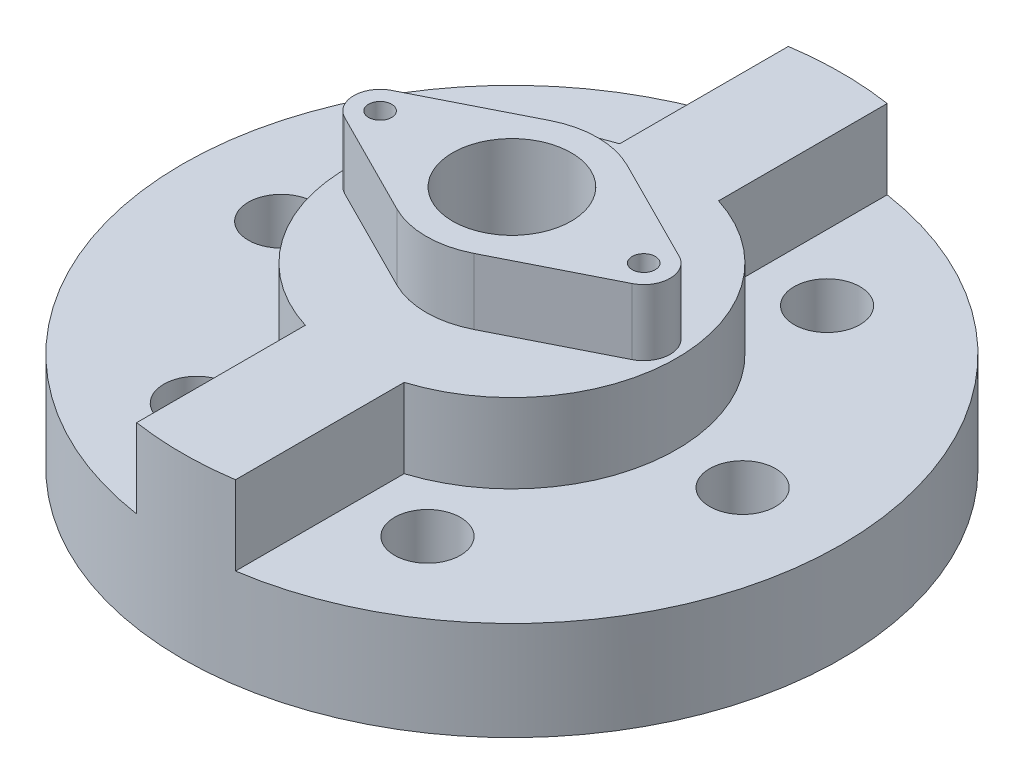
ISO-10303-21;
HEADER;
FILE_DESCRIPTION(('STEP AP214'),'2;1');
FILE_NAME('part.step','',(''),(''),'','','');
FILE_SCHEMA(('AUTOMOTIVE_DESIGN { 1 0 10303 214 1 1 1 1 }'));
ENDSEC;
DATA;
#1=APPLICATION_CONTEXT('core data for automotive mechanical design processes');
#2=APPLICATION_PROTOCOL_DEFINITION('international standard','automotive_design',2000,#1);
#3=PRODUCT_CONTEXT('',#1,'mechanical');
#4=PRODUCT('Part','Part','',(#3));
#5=PRODUCT_RELATED_PRODUCT_CATEGORY('part','',(#4));
#6=PRODUCT_DEFINITION_FORMATION('','',#4);
#7=PRODUCT_DEFINITION_CONTEXT('part definition',#1,'design');
#8=PRODUCT_DEFINITION('design','',#6,#7);
#9=PRODUCT_DEFINITION_SHAPE('','',#8);
#10=(LENGTH_UNIT() NAMED_UNIT(*) SI_UNIT(.MILLI.,.METRE.));
#11=(NAMED_UNIT(*) PLANE_ANGLE_UNIT() SI_UNIT($,.RADIAN.));
#12=(NAMED_UNIT(*) SI_UNIT($,.STERADIAN.) SOLID_ANGLE_UNIT());
#13=UNCERTAINTY_MEASURE_WITH_UNIT(LENGTH_MEASURE(1.E-05),#10,'distance_accuracy_value','');
#14=(GEOMETRIC_REPRESENTATION_CONTEXT(3) GLOBAL_UNCERTAINTY_ASSIGNED_CONTEXT((#13)) GLOBAL_UNIT_ASSIGNED_CONTEXT((#10,
#11,#12)) REPRESENTATION_CONTEXT('',''));
#15=CARTESIAN_POINT('',(0.,0.,0.));
#16=DIRECTION('',(0.,0.,1.));
#17=DIRECTION('',(1.,0.,0.));
#18=AXIS2_PLACEMENT_3D('',#15,#16,#17);
#19=CARTESIAN_POINT('',(0.,15.,0.));
#20=DIRECTION('',(0.,1.,0.));
#21=DIRECTION('',(0.,0.,1.));
#22=AXIS2_PLACEMENT_3D('',#19,#20,#21);
#23=PLANE('',#22);
#24=CARTESIAN_POINT('',(-17.4999999999997,15.,30.3108891324555));
#25=DIRECTION('',(0.,1.,0.));
#26=DIRECTION('',(0.,0.,1.));
#27=AXIS2_PLACEMENT_3D('',#24,#25,#26);
#28=CIRCLE('',#27,5.00000000000001);
#29=CARTESIAN_POINT('',(-17.4999999999997,15.,35.3108891324555));
#30=VERTEX_POINT('',#29);
#31=EDGE_CURVE('E660',#30,#30,#28,.T.);
#32=ORIENTED_EDGE('',*,*,#31,.F.);
#33=EDGE_LOOP('',(#32));
#34=FACE_BOUND('',#33,.T.);
#35=CARTESIAN_POINT('',(-35.,15.,0.));
#36=DIRECTION('',(0.,1.,0.));
#37=DIRECTION('',(0.,0.,1.));
#38=AXIS2_PLACEMENT_3D('',#35,#36,#37);
#39=CIRCLE('',#38,5.00000000000001);
#40=CARTESIAN_POINT('',(-35.,15.,5.00000000000001));
#41=VERTEX_POINT('',#40);
#42=EDGE_CURVE('E670',#41,#41,#39,.T.);
#43=ORIENTED_EDGE('',*,*,#42,.F.);
#44=EDGE_LOOP('',(#43));
#45=FACE_BOUND('',#44,.T.);
#46=CARTESIAN_POINT('',(-17.5000000000001,15.,-30.3108891324553));
#47=DIRECTION('',(0.,1.,0.));
#48=DIRECTION('',(0.,0.,1.));
#49=AXIS2_PLACEMENT_3D('',#46,#47,#48);
#50=CIRCLE('',#49,5.00000000000001);
#51=CARTESIAN_POINT('',(-17.5000000000001,15.,-25.3108891324553));
#52=VERTEX_POINT('',#51);
#53=EDGE_CURVE('E678',#52,#52,#50,.T.);
#54=ORIENTED_EDGE('',*,*,#53,.F.);
#55=EDGE_LOOP('',(#54));
#56=FACE_BOUND('',#55,.T.);
#57=DIRECTION('',(0.,0.,1.));
#58=VECTOR('',#57,1.);
#59=CARTESIAN_POINT('',(-7.50000000000001,15.,23.8484800354236));
#60=LINE('',#59,#58);
#61=CARTESIAN_POINT('',(-7.50000000000001,15.,23.8484800354236));
#62=VERTEX_POINT('',#61);
#63=CARTESIAN_POINT('',(-7.50000000000001,15.,49.434299833213));
#64=VERTEX_POINT('',#63);
#65=EDGE_CURVE('E199',#62,#64,#60,.T.);
#66=ORIENTED_EDGE('',*,*,#65,.F.);
#67=CARTESIAN_POINT('',(0.,15.,0.));
#68=DIRECTION('',(0.,1.,0.));
#69=DIRECTION('',(0.,0.,1.));
#70=AXIS2_PLACEMENT_3D('',#67,#68,#69);
#71=CIRCLE('',#70,25.);
#72=CARTESIAN_POINT('',(-7.5,15.,-23.8484800354236));
#73=VERTEX_POINT('',#72);
#74=EDGE_CURVE('E232',#73,#62,#71,.T.);
#75=ORIENTED_EDGE('',*,*,#74,.F.);
#76=DIRECTION('',(0.,0.,1.));
#77=VECTOR('',#76,1.);
#78=CARTESIAN_POINT('',(-7.5,15.,-49.434299833213));
#79=LINE('',#78,#77);
#80=CARTESIAN_POINT('',(-7.5,15.,-49.434299833213));
#81=VERTEX_POINT('',#80);
#82=EDGE_CURVE('E228',#81,#73,#79,.T.);
#83=ORIENTED_EDGE('',*,*,#82,.F.);
#84=CARTESIAN_POINT('',(0.,15.,0.));
#85=DIRECTION('',(0.,1.,0.));
#86=DIRECTION('',(0.,0.,1.));
#87=AXIS2_PLACEMENT_3D('',#84,#85,#86);
#88=CIRCLE('',#87,50.);
#89=EDGE_CURVE('E55',#81,#64,#88,.T.);
#90=ORIENTED_EDGE('',*,*,#89,.T.);
#91=EDGE_LOOP('',(#66,#75,#83,#90));
#92=FACE_BOUND('',#91,.T.);
#93=ADVANCED_FACE('F45',(#34,#45,#56,#92),#23,.T.);
#94=CARTESIAN_POINT('',(0.,15.,0.));
#95=DIRECTION('',(0.,-1.,0.));
#96=DIRECTION('',(0.,0.,-1.));
#97=AXIS2_PLACEMENT_3D('',#94,#95,#96);
#98=CYLINDRICAL_SURFACE('',#97,50.);
#99=CARTESIAN_POINT('',(7.50000000000001,15.,49.434299833213));
#100=VERTEX_POINT('',#99);
#101=CARTESIAN_POINT('',(7.5,15.,-49.434299833213));
#102=VERTEX_POINT('',#101);
#103=EDGE_CURVE('E11',#100,#102,#88,.T.);
#104=ORIENTED_EDGE('',*,*,#103,.F.);
#105=DIRECTION('',(0.,-1.,0.));
#106=VECTOR('',#105,1.);
#107=CARTESIAN_POINT('',(7.50000000000001,27.,49.434299833213));
#108=LINE('',#107,#106);
#109=CARTESIAN_POINT('',(7.50000000000001,27.,49.434299833213));
#110=VERTEX_POINT('',#109);
#111=EDGE_CURVE('E266',#110,#100,#108,.T.);
#112=ORIENTED_EDGE('',*,*,#111,.F.);
#113=CARTESIAN_POINT('',(0.,27.,0.));
#114=DIRECTION('',(0.,1.,0.));
#115=DIRECTION('',(0.,0.,1.));
#116=AXIS2_PLACEMENT_3D('',#113,#114,#115);
#117=CIRCLE('',#116,50.);
#118=CARTESIAN_POINT('',(-7.50000000000001,27.,49.434299833213));
#119=VERTEX_POINT('',#118);
#120=EDGE_CURVE('E194',#119,#110,#117,.T.);
#121=ORIENTED_EDGE('',*,*,#120,.F.);
#122=DIRECTION('',(0.,-1.,0.));
#123=VECTOR('',#122,1.);
#124=CARTESIAN_POINT('',(-7.50000000000001,27.,49.434299833213));
#125=LINE('',#124,#123);
#126=EDGE_CURVE('E219',#119,#64,#125,.T.);
#127=ORIENTED_EDGE('',*,*,#126,.T.);
#128=ORIENTED_EDGE('',*,*,#89,.F.);
#129=DIRECTION('',(0.,-1.,0.));
#130=VECTOR('',#129,1.);
#131=CARTESIAN_POINT('',(-7.5,27.,-49.434299833213));
#132=LINE('',#131,#130);
#133=CARTESIAN_POINT('',(-7.5,27.,-49.434299833213));
#134=VERTEX_POINT('',#133);
#135=EDGE_CURVE('E250',#134,#81,#132,.T.);
#136=ORIENTED_EDGE('',*,*,#135,.F.);
#137=CARTESIAN_POINT('',(0.,27.,0.));
#138=DIRECTION('',(0.,1.,0.));
#139=DIRECTION('',(0.,0.,1.));
#140=AXIS2_PLACEMENT_3D('',#137,#138,#139);
#141=CIRCLE('',#140,50.);
#142=CARTESIAN_POINT('',(7.5,27.,-49.434299833213));
#143=VERTEX_POINT('',#142);
#144=EDGE_CURVE('E208',#143,#134,#141,.T.);
#145=ORIENTED_EDGE('',*,*,#144,.F.);
#146=DIRECTION('',(0.,-1.,0.));
#147=VECTOR('',#146,1.);
#148=CARTESIAN_POINT('',(7.5,27.,-49.434299833213));
#149=LINE('',#148,#147);
#150=EDGE_CURVE('E254',#143,#102,#149,.T.);
#151=ORIENTED_EDGE('',*,*,#150,.T.);
#152=EDGE_LOOP('',(#104,#112,#121,#127,#128,#136,#145,#151));
#153=FACE_BOUND('',#152,.T.);
#154=CARTESIAN_POINT('',(0.,0.,0.));
#155=DIRECTION('',(0.,1.,0.));
#156=DIRECTION('',(0.,0.,1.));
#157=AXIS2_PLACEMENT_3D('',#154,#155,#156);
#158=CIRCLE('',#157,50.);
#159=CARTESIAN_POINT('',(0.,0.,50.));
#160=VERTEX_POINT('',#159);
#161=EDGE_CURVE('E49',#160,#160,#158,.T.);
#162=ORIENTED_EDGE('',*,*,#161,.T.);
#163=EDGE_LOOP('',(#162));
#164=FACE_BOUND('',#163,.T.);
#165=ADVANCED_FACE('F47',(#153,#164),#98,.T.);
#166=CARTESIAN_POINT('',(17.5000000000004,15.,30.3108891324552));
#167=DIRECTION('',(0.,1.,0.));
#168=DIRECTION('',(0.,0.,1.));
#169=AXIS2_PLACEMENT_3D('',#166,#167,#168);
#170=CIRCLE('',#169,5.00000000000001);
#171=CARTESIAN_POINT('',(17.5000000000004,15.,35.3108891324552));
#172=VERTEX_POINT('',#171);
#173=EDGE_CURVE('E334',#172,#172,#170,.T.);
#174=ORIENTED_EDGE('',*,*,#173,.F.);
#175=EDGE_LOOP('',(#174));
#176=FACE_BOUND('',#175,.T.);
#177=CARTESIAN_POINT('',(17.4999999999999,15.,-30.3108891324554));
#178=DIRECTION('',(0.,1.,0.));
#179=DIRECTION('',(0.,0.,1.));
#180=AXIS2_PLACEMENT_3D('',#177,#178,#179);
#181=CIRCLE('',#180,5.00000000000001);
#182=CARTESIAN_POINT('',(17.4999999999999,15.,-25.3108891324554));
#183=VERTEX_POINT('',#182);
#184=EDGE_CURVE('E338',#183,#183,#181,.T.);
#185=ORIENTED_EDGE('',*,*,#184,.F.);
#186=EDGE_LOOP('',(#185));
#187=FACE_BOUND('',#186,.T.);
#188=CARTESIAN_POINT('',(35.,15.,0.));
#189=DIRECTION('',(0.,1.,0.));
#190=DIRECTION('',(0.,0.,1.));
#191=AXIS2_PLACEMENT_3D('',#188,#189,#190);
#192=CIRCLE('',#191,5.00000000000001);
#193=CARTESIAN_POINT('',(35.,15.,5.00000000000001));
#194=VERTEX_POINT('',#193);
#195=EDGE_CURVE('E341',#194,#194,#192,.T.);
#196=ORIENTED_EDGE('',*,*,#195,.F.);
#197=EDGE_LOOP('',(#196));
#198=FACE_BOUND('',#197,.T.);
#199=DIRECTION('',(0.,0.,-1.));
#200=VECTOR('',#199,1.);
#201=CARTESIAN_POINT('',(7.5,15.,-49.434299833213));
#202=LINE('',#201,#200);
#203=CARTESIAN_POINT('',(7.5,15.,-23.8484800354236));
#204=VERTEX_POINT('',#203);
#205=EDGE_CURVE('E224',#204,#102,#202,.T.);
#206=ORIENTED_EDGE('',*,*,#205,.F.);
#207=CARTESIAN_POINT('',(0.,15.,0.));
#208=DIRECTION('',(0.,1.,0.));
#209=DIRECTION('',(0.,0.,1.));
#210=AXIS2_PLACEMENT_3D('',#207,#208,#209);
#211=CIRCLE('',#210,25.);
#212=CARTESIAN_POINT('',(7.50000000000001,15.,23.8484800354236));
#213=VERTEX_POINT('',#212);
#214=EDGE_CURVE('E188',#213,#204,#211,.T.);
#215=ORIENTED_EDGE('',*,*,#214,.F.);
#216=DIRECTION('',(0.,0.,-1.));
#217=VECTOR('',#216,1.);
#218=CARTESIAN_POINT('',(7.50000000000001,15.,23.8484800354236));
#219=LINE('',#218,#217);
#220=EDGE_CURVE('E183',#100,#213,#219,.T.);
#221=ORIENTED_EDGE('',*,*,#220,.F.);
#222=ORIENTED_EDGE('',*,*,#103,.T.);
#223=EDGE_LOOP('',(#206,#215,#221,#222));
#224=FACE_BOUND('',#223,.T.);
#225=ADVANCED_FACE('F305',(#176,#187,#198,#224),#23,.T.);
#226=CARTESIAN_POINT('',(0.,0.,0.));
#227=DIRECTION('',(0.,1.,0.));
#228=DIRECTION('',(0.,0.,1.));
#229=AXIS2_PLACEMENT_3D('',#226,#227,#228);
#230=PLANE('',#229);
#231=CARTESIAN_POINT('',(17.5000000000004,0.,30.3108891324552));
#232=DIRECTION('',(0.,1.,0.));
#233=DIRECTION('',(0.,0.,1.));
#234=AXIS2_PLACEMENT_3D('',#231,#232,#233);
#235=CIRCLE('',#234,5.00000000000001);
#236=CARTESIAN_POINT('',(17.5000000000004,0.,35.3108891324552));
#237=VERTEX_POINT('',#236);
#238=EDGE_CURVE('E656',#237,#237,#235,.T.);
#239=ORIENTED_EDGE('',*,*,#238,.T.);
#240=EDGE_LOOP('',(#239));
#241=FACE_BOUND('',#240,.T.);
#242=CARTESIAN_POINT('',(-17.4999999999997,0.,30.3108891324555));
#243=DIRECTION('',(0.,1.,0.));
#244=DIRECTION('',(0.,0.,1.));
#245=AXIS2_PLACEMENT_3D('',#242,#243,#244);
#246=CIRCLE('',#245,5.00000000000001);
#247=CARTESIAN_POINT('',(-17.4999999999997,0.,35.3108891324555));
#248=VERTEX_POINT('',#247);
#249=EDGE_CURVE('E666',#248,#248,#246,.T.);
#250=ORIENTED_EDGE('',*,*,#249,.T.);
#251=EDGE_LOOP('',(#250));
#252=FACE_BOUND('',#251,.T.);
#253=CARTESIAN_POINT('',(-35.,0.,0.));
#254=DIRECTION('',(0.,1.,0.));
#255=DIRECTION('',(0.,0.,1.));
#256=AXIS2_PLACEMENT_3D('',#253,#254,#255);
#257=CIRCLE('',#256,5.00000000000001);
#258=CARTESIAN_POINT('',(-35.,0.,5.00000000000001));
#259=VERTEX_POINT('',#258);
#260=EDGE_CURVE('E674',#259,#259,#257,.T.);
#261=ORIENTED_EDGE('',*,*,#260,.T.);
#262=EDGE_LOOP('',(#261));
#263=FACE_BOUND('',#262,.T.);
#264=CARTESIAN_POINT('',(-17.5000000000001,0.,-30.3108891324553));
#265=DIRECTION('',(0.,1.,0.));
#266=DIRECTION('',(0.,0.,1.));
#267=AXIS2_PLACEMENT_3D('',#264,#265,#266);
#268=CIRCLE('',#267,5.00000000000001);
#269=CARTESIAN_POINT('',(-17.5000000000001,0.,-25.3108891324553));
#270=VERTEX_POINT('',#269);
#271=EDGE_CURVE('E682',#270,#270,#268,.T.);
#272=ORIENTED_EDGE('',*,*,#271,.T.);
#273=EDGE_LOOP('',(#272));
#274=FACE_BOUND('',#273,.T.);
#275=CARTESIAN_POINT('',(17.4999999999999,0.,-30.3108891324554));
#276=DIRECTION('',(0.,1.,0.));
#277=DIRECTION('',(0.,0.,1.));
#278=AXIS2_PLACEMENT_3D('',#275,#276,#277);
#279=CIRCLE('',#278,5.00000000000001);
#280=CARTESIAN_POINT('',(17.4999999999999,0.,-25.3108891324554));
#281=VERTEX_POINT('',#280);
#282=EDGE_CURVE('E345',#281,#281,#279,.T.);
#283=ORIENTED_EDGE('',*,*,#282,.T.);
#284=EDGE_LOOP('',(#283));
#285=FACE_BOUND('',#284,.T.);
#286=CARTESIAN_POINT('',(35.,0.,0.));
#287=DIRECTION('',(0.,1.,0.));
#288=DIRECTION('',(0.,0.,1.));
#289=AXIS2_PLACEMENT_3D('',#286,#287,#288);
#290=CIRCLE('',#289,5.00000000000001);
#291=CARTESIAN_POINT('',(35.,0.,5.00000000000001));
#292=VERTEX_POINT('',#291);
#293=EDGE_CURVE('E344',#292,#292,#290,.T.);
#294=ORIENTED_EDGE('',*,*,#293,.T.);
#295=EDGE_LOOP('',(#294));
#296=FACE_BOUND('',#295,.T.);
#297=CARTESIAN_POINT('',(0.,0.,0.));
#298=DIRECTION('',(0.,1.,0.));
#299=DIRECTION('',(0.,0.,1.));
#300=AXIS2_PLACEMENT_3D('',#297,#298,#299);
#301=CIRCLE('',#300,9.00000000000001);
#302=CARTESIAN_POINT('',(0.,0.,9.00000000000001));
#303=VERTEX_POINT('',#302);
#304=EDGE_CURVE('E359',#303,#303,#301,.T.);
#305=ORIENTED_EDGE('',*,*,#304,.T.);
#306=EDGE_LOOP('',(#305));
#307=FACE_BOUND('',#306,.T.);
#308=ORIENTED_EDGE('',*,*,#161,.F.);
#309=EDGE_LOOP('',(#308));
#310=FACE_BOUND('',#309,.T.);
#311=ADVANCED_FACE('F310',(#241,#252,#263,#274,#285,#296,#307,#310),#230,.F.);
#312=CARTESIAN_POINT('',(7.50000000000001,27.,23.8484800354236));
#313=DIRECTION('',(-1.,0.,0.));
#314=DIRECTION('',(0.,0.,1.));
#315=AXIS2_PLACEMENT_3D('',#312,#313,#314);
#316=PLANE('',#315);
#317=ORIENTED_EDGE('',*,*,#220,.T.);
#318=DIRECTION('',(0.,-1.,0.));
#319=VECTOR('',#318,1.);
#320=CARTESIAN_POINT('',(7.50000000000001,27.,23.8484800354236));
#321=LINE('',#320,#319);
#322=CARTESIAN_POINT('',(7.50000000000001,27.,23.8484800354236));
#323=VERTEX_POINT('',#322);
#324=EDGE_CURVE('E262',#323,#213,#321,.T.);
#325=ORIENTED_EDGE('',*,*,#324,.F.);
#326=DIRECTION('',(0.,0.,-1.));
#327=VECTOR('',#326,1.);
#328=CARTESIAN_POINT('',(7.50000000000001,27.,23.8484800354236));
#329=LINE('',#328,#327);
#330=EDGE_CURVE('E198',#110,#323,#329,.T.);
#331=ORIENTED_EDGE('',*,*,#330,.F.);
#332=ORIENTED_EDGE('',*,*,#111,.T.);
#333=EDGE_LOOP('',(#317,#325,#331,#332));
#334=FACE_BOUND('',#333,.T.);
#335=ADVANCED_FACE('F308',(#334),#316,.F.);
#336=CARTESIAN_POINT('',(0.,27.,0.));
#337=DIRECTION('',(0.,-1.,0.));
#338=DIRECTION('',(0.,0.,-1.));
#339=AXIS2_PLACEMENT_3D('',#336,#337,#338);
#340=CYLINDRICAL_SURFACE('',#339,25.);
#341=ORIENTED_EDGE('',*,*,#214,.T.);
#342=DIRECTION('',(0.,-1.,0.));
#343=VECTOR('',#342,1.);
#344=CARTESIAN_POINT('',(7.5,27.,-23.8484800354236));
#345=LINE('',#344,#343);
#346=CARTESIAN_POINT('',(7.5,27.,-23.8484800354236));
#347=VERTEX_POINT('',#346);
#348=EDGE_CURVE('E258',#347,#204,#345,.T.);
#349=ORIENTED_EDGE('',*,*,#348,.F.);
#350=CARTESIAN_POINT('',(0.,27.,0.));
#351=DIRECTION('',(0.,1.,0.));
#352=DIRECTION('',(0.,0.,1.));
#353=AXIS2_PLACEMENT_3D('',#350,#351,#352);
#354=CIRCLE('',#353,25.);
#355=EDGE_CURVE('E202',#323,#347,#354,.T.);
#356=ORIENTED_EDGE('',*,*,#355,.F.);
#357=ORIENTED_EDGE('',*,*,#324,.T.);
#358=EDGE_LOOP('',(#341,#349,#356,#357));
#359=FACE_BOUND('',#358,.T.);
#360=ADVANCED_FACE('F307',(#359),#340,.T.);
#361=CARTESIAN_POINT('',(7.5,27.,-49.434299833213));
#362=DIRECTION('',(-1.,0.,0.));
#363=DIRECTION('',(0.,0.,1.));
#364=AXIS2_PLACEMENT_3D('',#361,#362,#363);
#365=PLANE('',#364);
#366=ORIENTED_EDGE('',*,*,#205,.T.);
#367=ORIENTED_EDGE('',*,*,#150,.F.);
#368=DIRECTION('',(0.,0.,-1.));
#369=VECTOR('',#368,1.);
#370=CARTESIAN_POINT('',(7.5,27.,-49.434299833213));
#371=LINE('',#370,#369);
#372=EDGE_CURVE('E205',#347,#143,#371,.T.);
#373=ORIENTED_EDGE('',*,*,#372,.F.);
#374=ORIENTED_EDGE('',*,*,#348,.T.);
#375=EDGE_LOOP('',(#366,#367,#373,#374));
#376=FACE_BOUND('',#375,.T.);
#377=ADVANCED_FACE('F303',(#376),#365,.F.);
#378=CARTESIAN_POINT('',(-7.5,27.,-49.434299833213));
#379=DIRECTION('',(1.,0.,0.));
#380=DIRECTION('',(0.,0.,-1.));
#381=AXIS2_PLACEMENT_3D('',#378,#379,#380);
#382=PLANE('',#381);
#383=ORIENTED_EDGE('',*,*,#82,.T.);
#384=DIRECTION('',(0.,-1.,0.));
#385=VECTOR('',#384,1.);
#386=CARTESIAN_POINT('',(-7.5,27.,-23.8484800354236));
#387=LINE('',#386,#385);
#388=CARTESIAN_POINT('',(-7.5,27.,-23.8484800354236));
#389=VERTEX_POINT('',#388);
#390=EDGE_CURVE('E246',#389,#73,#387,.T.);
#391=ORIENTED_EDGE('',*,*,#390,.F.);
#392=DIRECTION('',(0.,0.,1.));
#393=VECTOR('',#392,1.);
#394=CARTESIAN_POINT('',(-7.5,27.,-49.434299833213));
#395=LINE('',#394,#393);
#396=EDGE_CURVE('E211',#134,#389,#395,.T.);
#397=ORIENTED_EDGE('',*,*,#396,.F.);
#398=ORIENTED_EDGE('',*,*,#135,.T.);
#399=EDGE_LOOP('',(#383,#391,#397,#398));
#400=FACE_BOUND('',#399,.T.);
#401=ADVANCED_FACE('F296',(#400),#382,.F.);
#402=CARTESIAN_POINT('',(0.,27.,0.));
#403=DIRECTION('',(0.,-1.,0.));
#404=DIRECTION('',(0.,0.,-1.));
#405=AXIS2_PLACEMENT_3D('',#402,#403,#404);
#406=CYLINDRICAL_SURFACE('',#405,25.);
#407=ORIENTED_EDGE('',*,*,#74,.T.);
#408=DIRECTION('',(0.,-1.,0.));
#409=VECTOR('',#408,1.);
#410=CARTESIAN_POINT('',(-7.50000000000001,27.,23.8484800354236));
#411=LINE('',#410,#409);
#412=CARTESIAN_POINT('',(-7.50000000000001,27.,23.8484800354236));
#413=VERTEX_POINT('',#412);
#414=EDGE_CURVE('E242',#413,#62,#411,.T.);
#415=ORIENTED_EDGE('',*,*,#414,.F.);
#416=CARTESIAN_POINT('',(0.,27.,0.));
#417=DIRECTION('',(0.,1.,0.));
#418=DIRECTION('',(0.,0.,1.));
#419=AXIS2_PLACEMENT_3D('',#416,#417,#418);
#420=CIRCLE('',#419,25.);
#421=EDGE_CURVE('E214',#389,#413,#420,.T.);
#422=ORIENTED_EDGE('',*,*,#421,.F.);
#423=ORIENTED_EDGE('',*,*,#390,.T.);
#424=EDGE_LOOP('',(#407,#415,#422,#423));
#425=FACE_BOUND('',#424,.T.);
#426=ADVANCED_FACE('F294',(#425),#406,.T.);
#427=CARTESIAN_POINT('',(-7.50000000000001,27.,23.8484800354236));
#428=DIRECTION('',(1.,0.,0.));
#429=DIRECTION('',(0.,0.,-1.));
#430=AXIS2_PLACEMENT_3D('',#427,#428,#429);
#431=PLANE('',#430);
#432=ORIENTED_EDGE('',*,*,#65,.T.);
#433=ORIENTED_EDGE('',*,*,#126,.F.);
#434=DIRECTION('',(0.,0.,1.));
#435=VECTOR('',#434,1.);
#436=CARTESIAN_POINT('',(-7.50000000000001,27.,23.8484800354236));
#437=LINE('',#436,#435);
#438=EDGE_CURVE('E217',#413,#119,#437,.T.);
#439=ORIENTED_EDGE('',*,*,#438,.F.);
#440=ORIENTED_EDGE('',*,*,#414,.T.);
#441=EDGE_LOOP('',(#432,#433,#439,#440));
#442=FACE_BOUND('',#441,.T.);
#443=ADVANCED_FACE('F282',(#442),#431,.F.);
#444=CARTESIAN_POINT('',(0.,27.,0.));
#445=DIRECTION('',(0.,1.,0.));
#446=DIRECTION('',(0.,0.,1.));
#447=AXIS2_PLACEMENT_3D('',#444,#445,#446);
#448=PLANE('',#447);
#449=CARTESIAN_POINT('',(-20.,27.,0.));
#450=DIRECTION('',(0.,1.,0.));
#451=DIRECTION('',(0.,0.,1.));
#452=AXIS2_PLACEMENT_3D('',#449,#450,#451);
#453=CIRCLE('',#452,4.);
#454=CARTESIAN_POINT('',(-21.8,27.,-3.57211421989835));
#455=VERTEX_POINT('',#454);
#456=CARTESIAN_POINT('',(-21.8,27.,3.57211421989835));
#457=VERTEX_POINT('',#456);
#458=EDGE_CURVE('E62',#455,#457,#453,.T.);
#459=ORIENTED_EDGE('',*,*,#458,.F.);
#460=DIRECTION('',(-0.893028554974588,0.,0.45));
#461=VECTOR('',#460,1.);
#462=CARTESIAN_POINT('',(-21.8,27.,-3.57211421989835));
#463=LINE('',#462,#461);
#464=CARTESIAN_POINT('',(-5.85,27.,-11.6093712146696));
#465=VERTEX_POINT('',#464);
#466=EDGE_CURVE('E66',#465,#455,#463,.T.);
#467=ORIENTED_EDGE('',*,*,#466,.F.);
#468=CARTESIAN_POINT('',(0.,27.,0.));
#469=DIRECTION('',(0.,1.,0.));
#470=DIRECTION('',(0.,0.,1.));
#471=AXIS2_PLACEMENT_3D('',#468,#469,#470);
#472=CIRCLE('',#471,13.);
#473=CARTESIAN_POINT('',(5.85,27.,-11.6093712146696));
#474=VERTEX_POINT('',#473);
#475=EDGE_CURVE('E417',#474,#465,#472,.T.);
#476=ORIENTED_EDGE('',*,*,#475,.F.);
#477=DIRECTION('',(-0.893028554974588,0.,-0.45));
#478=VECTOR('',#477,1.);
#479=CARTESIAN_POINT('',(21.8,27.,-3.57211421989835));
#480=LINE('',#479,#478);
#481=CARTESIAN_POINT('',(21.8,27.,-3.57211421989835));
#482=VERTEX_POINT('',#481);
#483=EDGE_CURVE('E413',#482,#474,#480,.T.);
#484=ORIENTED_EDGE('',*,*,#483,.F.);
#485=CARTESIAN_POINT('',(20.,27.,0.));
#486=DIRECTION('',(0.,1.,0.));
#487=DIRECTION('',(0.,0.,-1.));
#488=AXIS2_PLACEMENT_3D('',#485,#486,#487);
#489=CIRCLE('',#488,4.);
#490=CARTESIAN_POINT('',(21.8,27.,3.57211421989835));
#491=VERTEX_POINT('',#490);
#492=EDGE_CURVE('E409',#491,#482,#489,.T.);
#493=ORIENTED_EDGE('',*,*,#492,.F.);
#494=DIRECTION('',(0.893028554974588,0.,-0.45));
#495=VECTOR('',#494,1.);
#496=CARTESIAN_POINT('',(21.8,27.,3.57211421989835));
#497=LINE('',#496,#495);
#498=CARTESIAN_POINT('',(5.85,27.,11.6093712146696));
#499=VERTEX_POINT('',#498);
#500=EDGE_CURVE('E405',#499,#491,#497,.T.);
#501=ORIENTED_EDGE('',*,*,#500,.F.);
#502=CARTESIAN_POINT('',(0.,27.,0.));
#503=DIRECTION('',(0.,1.,0.));
#504=DIRECTION('',(0.,0.,1.));
#505=AXIS2_PLACEMENT_3D('',#502,#503,#504);
#506=CIRCLE('',#505,13.);
#507=CARTESIAN_POINT('',(-5.85,27.,11.6093712146696));
#508=VERTEX_POINT('',#507);
#509=EDGE_CURVE('E401',#508,#499,#506,.T.);
#510=ORIENTED_EDGE('',*,*,#509,.F.);
#511=DIRECTION('',(0.893028554974588,0.,0.45));
#512=VECTOR('',#511,1.);
#513=CARTESIAN_POINT('',(-21.8,27.,3.57211421989835));
#514=LINE('',#513,#512);
#515=EDGE_CURVE('E398',#457,#508,#514,.T.);
#516=ORIENTED_EDGE('',*,*,#515,.F.);
#517=EDGE_LOOP('',(#459,#467,#476,#484,#493,#501,#510,#516));
#518=FACE_BOUND('',#517,.T.);
#519=ORIENTED_EDGE('',*,*,#120,.T.);
#520=ORIENTED_EDGE('',*,*,#330,.T.);
#521=ORIENTED_EDGE('',*,*,#355,.T.);
#522=ORIENTED_EDGE('',*,*,#372,.T.);
#523=ORIENTED_EDGE('',*,*,#144,.T.);
#524=ORIENTED_EDGE('',*,*,#396,.T.);
#525=ORIENTED_EDGE('',*,*,#421,.T.);
#526=ORIENTED_EDGE('',*,*,#438,.T.);
#527=EDGE_LOOP('',(#519,#520,#521,#522,#523,#524,#525,#526));
#528=FACE_BOUND('',#527,.T.);
#529=ADVANCED_FACE('F288',(#518,#528),#448,.T.);
#530=CARTESIAN_POINT('',(-20.,37.,0.));
#531=DIRECTION('',(0.,1.,0.));
#532=DIRECTION('',(0.,0.,1.));
#533=AXIS2_PLACEMENT_3D('',#530,#531,#532);
#534=PLANE('',#533);
#535=CARTESIAN_POINT('',(0.,37.,0.));
#536=DIRECTION('',(0.,1.,0.));
#537=DIRECTION('',(0.,0.,1.));
#538=AXIS2_PLACEMENT_3D('',#535,#536,#537);
#539=CIRCLE('',#538,9.00000000000001);
#540=CARTESIAN_POINT('',(0.,37.,9.00000000000001));
#541=VERTEX_POINT('',#540);
#542=EDGE_CURVE('E350',#541,#541,#539,.T.);
#543=ORIENTED_EDGE('',*,*,#542,.F.);
#544=EDGE_LOOP('',(#543));
#545=FACE_BOUND('',#544,.T.);
#546=CARTESIAN_POINT('',(-20.,37.,0.));
#547=DIRECTION('',(0.,1.,0.));
#548=DIRECTION('',(0.,0.,1.));
#549=AXIS2_PLACEMENT_3D('',#546,#547,#548);
#550=CIRCLE('',#549,1.75);
#551=CARTESIAN_POINT('',(-20.,37.,1.75));
#552=VERTEX_POINT('',#551);
#553=EDGE_CURVE('E372',#552,#552,#550,.T.);
#554=ORIENTED_EDGE('',*,*,#553,.F.);
#555=EDGE_LOOP('',(#554));
#556=FACE_BOUND('',#555,.T.);
#557=CARTESIAN_POINT('',(-20.,37.,0.));
#558=DIRECTION('',(0.,1.,0.));
#559=DIRECTION('',(0.,0.,1.));
#560=AXIS2_PLACEMENT_3D('',#557,#558,#559);
#561=CIRCLE('',#560,4.);
#562=CARTESIAN_POINT('',(-21.8,37.,-3.57211421989835));
#563=VERTEX_POINT('',#562);
#564=CARTESIAN_POINT('',(-21.8,37.,3.57211421989835));
#565=VERTEX_POINT('',#564);
#566=EDGE_CURVE('E169',#563,#565,#561,.T.);
#567=ORIENTED_EDGE('',*,*,#566,.T.);
#568=DIRECTION('',(0.893028554974588,0.,0.45));
#569=VECTOR('',#568,1.);
#570=CARTESIAN_POINT('',(-21.8,37.,3.57211421989835));
#571=LINE('',#570,#569);
#572=CARTESIAN_POINT('',(-5.85,37.,11.6093712146696));
#573=VERTEX_POINT('',#572);
#574=EDGE_CURVE('E157',#565,#573,#571,.T.);
#575=ORIENTED_EDGE('',*,*,#574,.T.);
#576=CARTESIAN_POINT('',(0.,37.,0.));
#577=DIRECTION('',(0.,1.,0.));
#578=DIRECTION('',(0.,0.,1.));
#579=AXIS2_PLACEMENT_3D('',#576,#577,#578);
#580=CIRCLE('',#579,13.);
#581=CARTESIAN_POINT('',(5.85,37.,11.6093712146696));
#582=VERTEX_POINT('',#581);
#583=EDGE_CURVE('E168',#573,#582,#580,.T.);
#584=ORIENTED_EDGE('',*,*,#583,.T.);
#585=DIRECTION('',(0.893028554974588,0.,-0.45));
#586=VECTOR('',#585,1.);
#587=CARTESIAN_POINT('',(21.8,37.,3.57211421989835));
#588=LINE('',#587,#586);
#589=CARTESIAN_POINT('',(21.8,37.,3.57211421989835));
#590=VERTEX_POINT('',#589);
#591=EDGE_CURVE('E381',#582,#590,#588,.T.);
#592=ORIENTED_EDGE('',*,*,#591,.T.);
#593=CARTESIAN_POINT('',(20.,37.,0.));
#594=DIRECTION('',(0.,1.,0.));
#595=DIRECTION('',(0.,0.,-1.));
#596=AXIS2_PLACEMENT_3D('',#593,#594,#595);
#597=CIRCLE('',#596,4.);
#598=CARTESIAN_POINT('',(21.8,37.,-3.57211421989835));
#599=VERTEX_POINT('',#598);
#600=EDGE_CURVE('E384',#590,#599,#597,.T.);
#601=ORIENTED_EDGE('',*,*,#600,.T.);
#602=DIRECTION('',(-0.893028554974588,0.,-0.45));
#603=VECTOR('',#602,1.);
#604=CARTESIAN_POINT('',(21.8,37.,-3.57211421989835));
#605=LINE('',#604,#603);
#606=CARTESIAN_POINT('',(5.85,37.,-11.6093712146696));
#607=VERTEX_POINT('',#606);
#608=EDGE_CURVE('E387',#599,#607,#605,.T.);
#609=ORIENTED_EDGE('',*,*,#608,.T.);
#610=CARTESIAN_POINT('',(0.,37.,0.));
#611=DIRECTION('',(0.,1.,0.));
#612=DIRECTION('',(0.,0.,1.));
#613=AXIS2_PLACEMENT_3D('',#610,#611,#612);
#614=CIRCLE('',#613,13.);
#615=CARTESIAN_POINT('',(-5.85,37.,-11.6093712146696));
#616=VERTEX_POINT('',#615);
#617=EDGE_CURVE('E390',#607,#616,#614,.T.);
#618=ORIENTED_EDGE('',*,*,#617,.T.);
#619=DIRECTION('',(-0.893028554974588,0.,0.45));
#620=VECTOR('',#619,1.);
#621=CARTESIAN_POINT('',(-21.8,37.,-3.57211421989835));
#622=LINE('',#621,#620);
#623=EDGE_CURVE('E175',#616,#563,#622,.T.);
#624=ORIENTED_EDGE('',*,*,#623,.T.);
#625=EDGE_LOOP('',(#567,#575,#584,#592,#601,#609,#618,#624));
#626=FACE_BOUND('',#625,.T.);
#627=CARTESIAN_POINT('',(20.,37.,0.));
#628=DIRECTION('',(0.,1.,0.));
#629=DIRECTION('',(0.,0.,1.));
#630=AXIS2_PLACEMENT_3D('',#627,#628,#629);
#631=CIRCLE('',#630,1.75);
#632=CARTESIAN_POINT('',(20.,37.,1.75));
#633=VERTEX_POINT('',#632);
#634=EDGE_CURVE('E364',#633,#633,#631,.T.);
#635=ORIENTED_EDGE('',*,*,#634,.F.);
#636=EDGE_LOOP('',(#635));
#637=FACE_BOUND('',#636,.T.);
#638=ADVANCED_FACE('F172',(#545,#556,#626,#637),#534,.T.);
#639=CARTESIAN_POINT('',(-20.,37.,0.));
#640=DIRECTION('',(0.,-1.,0.));
#641=DIRECTION('',(0.,0.,-1.));
#642=AXIS2_PLACEMENT_3D('',#639,#640,#641);
#643=CYLINDRICAL_SURFACE('',#642,4.);
#644=ORIENTED_EDGE('',*,*,#458,.T.);
#645=DIRECTION('',(0.,-1.,0.));
#646=VECTOR('',#645,1.);
#647=CARTESIAN_POINT('',(-21.8,37.,3.57211421989835));
#648=LINE('',#647,#646);
#649=EDGE_CURVE('E162',#565,#457,#648,.T.);
#650=ORIENTED_EDGE('',*,*,#649,.F.);
#651=ORIENTED_EDGE('',*,*,#566,.F.);
#652=DIRECTION('',(0.,-1.,0.));
#653=VECTOR('',#652,1.);
#654=CARTESIAN_POINT('',(-21.8,37.,-3.57211421989835));
#655=LINE('',#654,#653);
#656=EDGE_CURVE('E395',#563,#455,#655,.T.);
#657=ORIENTED_EDGE('',*,*,#656,.T.);
#658=EDGE_LOOP('',(#644,#650,#651,#657));
#659=FACE_BOUND('',#658,.T.);
#660=ADVANCED_FACE('F181',(#659),#643,.T.);
#661=CARTESIAN_POINT('',(-21.8,37.,3.57211421989835));
#662=DIRECTION('',(0.45,0.,-0.893028554974588));
#663=DIRECTION('',(-0.893028554974588,0.,-0.45));
#664=AXIS2_PLACEMENT_3D('',#661,#662,#663);
#665=PLANE('',#664);
#666=ORIENTED_EDGE('',*,*,#515,.T.);
#667=DIRECTION('',(0.,-1.,0.));
#668=VECTOR('',#667,1.);
#669=CARTESIAN_POINT('',(-5.85,37.,11.6093712146696));
#670=LINE('',#669,#668);
#671=EDGE_CURVE('E164',#573,#508,#670,.T.);
#672=ORIENTED_EDGE('',*,*,#671,.F.);
#673=ORIENTED_EDGE('',*,*,#574,.F.);
#674=ORIENTED_EDGE('',*,*,#649,.T.);
#675=EDGE_LOOP('',(#666,#672,#673,#674));
#676=FACE_BOUND('',#675,.T.);
#677=ADVANCED_FACE('F160',(#676),#665,.F.);
#678=CARTESIAN_POINT('',(0.,37.,0.));
#679=DIRECTION('',(0.,-1.,0.));
#680=DIRECTION('',(0.,0.,-1.));
#681=AXIS2_PLACEMENT_3D('',#678,#679,#680);
#682=CYLINDRICAL_SURFACE('',#681,13.);
#683=ORIENTED_EDGE('',*,*,#509,.T.);
#684=DIRECTION('',(0.,-1.,0.));
#685=VECTOR('',#684,1.);
#686=CARTESIAN_POINT('',(5.85,37.,11.6093712146696));
#687=LINE('',#686,#685);
#688=EDGE_CURVE('E190',#582,#499,#687,.T.);
#689=ORIENTED_EDGE('',*,*,#688,.F.);
#690=ORIENTED_EDGE('',*,*,#583,.F.);
#691=ORIENTED_EDGE('',*,*,#671,.T.);
#692=EDGE_LOOP('',(#683,#689,#690,#691));
#693=FACE_BOUND('',#692,.T.);
#694=ADVANCED_FACE('F447',(#693),#682,.T.);
#695=CARTESIAN_POINT('',(21.8,37.,3.57211421989835));
#696=DIRECTION('',(-0.45,0.,-0.893028554974588));
#697=DIRECTION('',(-0.893028554974588,0.,0.45));
#698=AXIS2_PLACEMENT_3D('',#695,#696,#697);
#699=PLANE('',#698);
#700=ORIENTED_EDGE('',*,*,#500,.T.);
#701=DIRECTION('',(0.,-1.,0.));
#702=VECTOR('',#701,1.);
#703=CARTESIAN_POINT('',(21.8,37.,3.57211421989835));
#704=LINE('',#703,#702);
#705=EDGE_CURVE('E436',#590,#491,#704,.T.);
#706=ORIENTED_EDGE('',*,*,#705,.F.);
#707=ORIENTED_EDGE('',*,*,#591,.F.);
#708=ORIENTED_EDGE('',*,*,#688,.T.);
#709=EDGE_LOOP('',(#700,#706,#707,#708));
#710=FACE_BOUND('',#709,.T.);
#711=ADVANCED_FACE('F444',(#710),#699,.F.);
#712=CARTESIAN_POINT('',(20.,37.,0.));
#713=DIRECTION('',(0.,-1.,0.));
#714=DIRECTION('',(0.,0.,-1.));
#715=AXIS2_PLACEMENT_3D('',#712,#713,#714);
#716=CYLINDRICAL_SURFACE('',#715,4.);
#717=ORIENTED_EDGE('',*,*,#492,.T.);
#718=DIRECTION('',(0.,-1.,0.));
#719=VECTOR('',#718,1.);
#720=CARTESIAN_POINT('',(21.8,37.,-3.57211421989835));
#721=LINE('',#720,#719);
#722=EDGE_CURVE('E432',#599,#482,#721,.T.);
#723=ORIENTED_EDGE('',*,*,#722,.F.);
#724=ORIENTED_EDGE('',*,*,#600,.F.);
#725=ORIENTED_EDGE('',*,*,#705,.T.);
#726=EDGE_LOOP('',(#717,#723,#724,#725));
#727=FACE_BOUND('',#726,.T.);
#728=ADVANCED_FACE('F450',(#727),#716,.T.);
#729=CARTESIAN_POINT('',(21.8,37.,-3.57211421989835));
#730=DIRECTION('',(-0.45,0.,0.893028554974588));
#731=DIRECTION('',(0.893028554974588,0.,0.45));
#732=AXIS2_PLACEMENT_3D('',#729,#730,#731);
#733=PLANE('',#732);
#734=ORIENTED_EDGE('',*,*,#483,.T.);
#735=DIRECTION('',(0.,-1.,0.));
#736=VECTOR('',#735,1.);
#737=CARTESIAN_POINT('',(5.85,37.,-11.6093712146696));
#738=LINE('',#737,#736);
#739=EDGE_CURVE('E428',#607,#474,#738,.T.);
#740=ORIENTED_EDGE('',*,*,#739,.F.);
#741=ORIENTED_EDGE('',*,*,#608,.F.);
#742=ORIENTED_EDGE('',*,*,#722,.T.);
#743=EDGE_LOOP('',(#734,#740,#741,#742));
#744=FACE_BOUND('',#743,.T.);
#745=ADVANCED_FACE('F454',(#744),#733,.F.);
#746=CARTESIAN_POINT('',(0.,37.,0.));
#747=DIRECTION('',(0.,-1.,0.));
#748=DIRECTION('',(0.,0.,-1.));
#749=AXIS2_PLACEMENT_3D('',#746,#747,#748);
#750=CYLINDRICAL_SURFACE('',#749,13.);
#751=ORIENTED_EDGE('',*,*,#475,.T.);
#752=DIRECTION('',(0.,-1.,0.));
#753=VECTOR('',#752,1.);
#754=CARTESIAN_POINT('',(-5.85,37.,-11.6093712146696));
#755=LINE('',#754,#753);
#756=EDGE_CURVE('E424',#616,#465,#755,.T.);
#757=ORIENTED_EDGE('',*,*,#756,.F.);
#758=ORIENTED_EDGE('',*,*,#617,.F.);
#759=ORIENTED_EDGE('',*,*,#739,.T.);
#760=EDGE_LOOP('',(#751,#757,#758,#759));
#761=FACE_BOUND('',#760,.T.);
#762=ADVANCED_FACE('F459',(#761),#750,.T.);
#763=CARTESIAN_POINT('',(-21.8,37.,-3.57211421989835));
#764=DIRECTION('',(0.45,0.,0.893028554974588));
#765=DIRECTION('',(0.893028554974588,0.,-0.45));
#766=AXIS2_PLACEMENT_3D('',#763,#764,#765);
#767=PLANE('',#766);
#768=ORIENTED_EDGE('',*,*,#466,.T.);
#769=ORIENTED_EDGE('',*,*,#656,.F.);
#770=ORIENTED_EDGE('',*,*,#623,.F.);
#771=ORIENTED_EDGE('',*,*,#756,.T.);
#772=EDGE_LOOP('',(#768,#769,#770,#771));
#773=FACE_BOUND('',#772,.T.);
#774=ADVANCED_FACE('F461',(#773),#767,.F.);
#775=CARTESIAN_POINT('',(-20.,37.,0.));
#776=DIRECTION('',(0.,-1.,0.));
#777=DIRECTION('',(0.,0.,-1.));
#778=AXIS2_PLACEMENT_3D('',#775,#776,#777);
#779=CYLINDRICAL_SURFACE('',#778,1.75);
#780=ORIENTED_EDGE('',*,*,#553,.T.);
#781=EDGE_LOOP('',(#780));
#782=FACE_BOUND('',#781,.T.);
#783=CARTESIAN_POINT('',(-20.,27.,0.));
#784=DIRECTION('',(0.,1.,0.));
#785=DIRECTION('',(0.,0.,1.));
#786=AXIS2_PLACEMENT_3D('',#783,#784,#785);
#787=CIRCLE('',#786,1.75);
#788=CARTESIAN_POINT('',(-20.,27.,1.75));
#789=VERTEX_POINT('',#788);
#790=EDGE_CURVE('E368',#789,#789,#787,.T.);
#791=ORIENTED_EDGE('',*,*,#790,.F.);
#792=EDGE_LOOP('',(#791));
#793=FACE_BOUND('',#792,.T.);
#794=ADVANCED_FACE('F463',(#782,#793),#779,.F.);
#795=CARTESIAN_POINT('',(20.,37.,0.));
#796=DIRECTION('',(0.,-1.,0.));
#797=DIRECTION('',(0.,0.,-1.));
#798=AXIS2_PLACEMENT_3D('',#795,#796,#797);
#799=CYLINDRICAL_SURFACE('',#798,1.75);
#800=ORIENTED_EDGE('',*,*,#634,.T.);
#801=EDGE_LOOP('',(#800));
#802=FACE_BOUND('',#801,.T.);
#803=CARTESIAN_POINT('',(20.,27.,0.));
#804=DIRECTION('',(0.,1.,0.));
#805=DIRECTION('',(0.,0.,1.));
#806=AXIS2_PLACEMENT_3D('',#803,#804,#805);
#807=CIRCLE('',#806,1.75);
#808=CARTESIAN_POINT('',(20.,27.,1.75));
#809=VERTEX_POINT('',#808);
#810=EDGE_CURVE('E363',#809,#809,#807,.T.);
#811=ORIENTED_EDGE('',*,*,#810,.F.);
#812=EDGE_LOOP('',(#811));
#813=FACE_BOUND('',#812,.T.);
#814=ADVANCED_FACE('F469',(#802,#813),#799,.F.);
#815=ORIENTED_EDGE('',*,*,#790,.T.);
#816=EDGE_LOOP('',(#815));
#817=FACE_BOUND('',#816,.T.);
#818=ADVANCED_FACE('F489',(#817),#448,.T.);
#819=ORIENTED_EDGE('',*,*,#810,.T.);
#820=EDGE_LOOP('',(#819));
#821=FACE_BOUND('',#820,.T.);
#822=ADVANCED_FACE('F490',(#821),#448,.T.);
#823=CARTESIAN_POINT('',(0.,37.,0.));
#824=DIRECTION('',(0.,1.,0.));
#825=DIRECTION('',(0.,0.,1.));
#826=AXIS2_PLACEMENT_3D('',#823,#824,#825);
#827=CYLINDRICAL_SURFACE('',#826,9.00000000000001);
#828=ORIENTED_EDGE('',*,*,#304,.F.);
#829=EDGE_LOOP('',(#828));
#830=FACE_BOUND('',#829,.T.);
#831=ORIENTED_EDGE('',*,*,#542,.T.);
#832=EDGE_LOOP('',(#831));
#833=FACE_BOUND('',#832,.T.);
#834=ADVANCED_FACE('F585',(#830,#833),#827,.F.);
#835=CARTESIAN_POINT('',(35.,15.,0.));
#836=DIRECTION('',(0.,1.,0.));
#837=DIRECTION('',(0.,0.,1.));
#838=AXIS2_PLACEMENT_3D('',#835,#836,#837);
#839=CYLINDRICAL_SURFACE('',#838,5.00000000000001);
#840=ORIENTED_EDGE('',*,*,#293,.F.);
#841=EDGE_LOOP('',(#840));
#842=FACE_BOUND('',#841,.T.);
#843=ORIENTED_EDGE('',*,*,#195,.T.);
#844=EDGE_LOOP('',(#843));
#845=FACE_BOUND('',#844,.T.);
#846=ADVANCED_FACE('F590',(#842,#845),#839,.F.);
#847=CARTESIAN_POINT('',(17.4999999999999,15.,-30.3108891324554));
#848=DIRECTION('',(0.,1.,0.));
#849=DIRECTION('',(0.,0.,1.));
#850=AXIS2_PLACEMENT_3D('',#847,#848,#849);
#851=CYLINDRICAL_SURFACE('',#850,5.00000000000001);
#852=ORIENTED_EDGE('',*,*,#282,.F.);
#853=EDGE_LOOP('',(#852));
#854=FACE_BOUND('',#853,.T.);
#855=ORIENTED_EDGE('',*,*,#184,.T.);
#856=EDGE_LOOP('',(#855));
#857=FACE_BOUND('',#856,.T.);
#858=ADVANCED_FACE('F600',(#854,#857),#851,.F.);
#859=CARTESIAN_POINT('',(-17.5000000000001,15.,-30.3108891324553));
#860=DIRECTION('',(0.,1.,0.));
#861=DIRECTION('',(0.,0.,1.));
#862=AXIS2_PLACEMENT_3D('',#859,#860,#861);
#863=CYLINDRICAL_SURFACE('',#862,5.00000000000001);
#864=ORIENTED_EDGE('',*,*,#271,.F.);
#865=EDGE_LOOP('',(#864));
#866=FACE_BOUND('',#865,.T.);
#867=ORIENTED_EDGE('',*,*,#53,.T.);
#868=EDGE_LOOP('',(#867));
#869=FACE_BOUND('',#868,.T.);
#870=ADVANCED_FACE('F610',(#866,#869),#863,.F.);
#871=CARTESIAN_POINT('',(-35.,15.,0.));
#872=DIRECTION('',(0.,1.,0.));
#873=DIRECTION('',(0.,0.,1.));
#874=AXIS2_PLACEMENT_3D('',#871,#872,#873);
#875=CYLINDRICAL_SURFACE('',#874,5.00000000000001);
#876=ORIENTED_EDGE('',*,*,#260,.F.);
#877=EDGE_LOOP('',(#876));
#878=FACE_BOUND('',#877,.T.);
#879=ORIENTED_EDGE('',*,*,#42,.T.);
#880=EDGE_LOOP('',(#879));
#881=FACE_BOUND('',#880,.T.);
#882=ADVANCED_FACE('F620',(#878,#881),#875,.F.);
#883=CARTESIAN_POINT('',(-17.4999999999997,15.,30.3108891324555));
#884=DIRECTION('',(0.,1.,0.));
#885=DIRECTION('',(0.,0.,1.));
#886=AXIS2_PLACEMENT_3D('',#883,#884,#885);
#887=CYLINDRICAL_SURFACE('',#886,5.00000000000001);
#888=ORIENTED_EDGE('',*,*,#249,.F.);
#889=EDGE_LOOP('',(#888));
#890=FACE_BOUND('',#889,.T.);
#891=ORIENTED_EDGE('',*,*,#31,.T.);
#892=EDGE_LOOP('',(#891));
#893=FACE_BOUND('',#892,.T.);
#894=ADVANCED_FACE('F630',(#890,#893),#887,.F.);
#895=CARTESIAN_POINT('',(17.5000000000004,15.,30.3108891324552));
#896=DIRECTION('',(0.,1.,0.));
#897=DIRECTION('',(0.,0.,1.));
#898=AXIS2_PLACEMENT_3D('',#895,#896,#897);
#899=CYLINDRICAL_SURFACE('',#898,5.00000000000001);
#900=ORIENTED_EDGE('',*,*,#238,.F.);
#901=EDGE_LOOP('',(#900));
#902=FACE_BOUND('',#901,.T.);
#903=ORIENTED_EDGE('',*,*,#173,.T.);
#904=EDGE_LOOP('',(#903));
#905=FACE_BOUND('',#904,.T.);
#906=ADVANCED_FACE('F640',(#902,#905),#899,.F.);
#907=CLOSED_SHELL('',(#93,#165,#225,#311,#335,#360,#377,#401,#426,#443,#529,#638,#660,#677,#694,
#711,#728,#745,#762,#774,#794,#814,#818,#822,#834,#846,#858,#870,#882,#894,#906));
#908=MANIFOLD_SOLID_BREP('B2',#907);
#909=ADVANCED_BREP_SHAPE_REPRESENTATION('',(#18,#908),#14);
#910=SHAPE_DEFINITION_REPRESENTATION(#9,#909);
ENDSEC;
END-ISO-10303-21;
